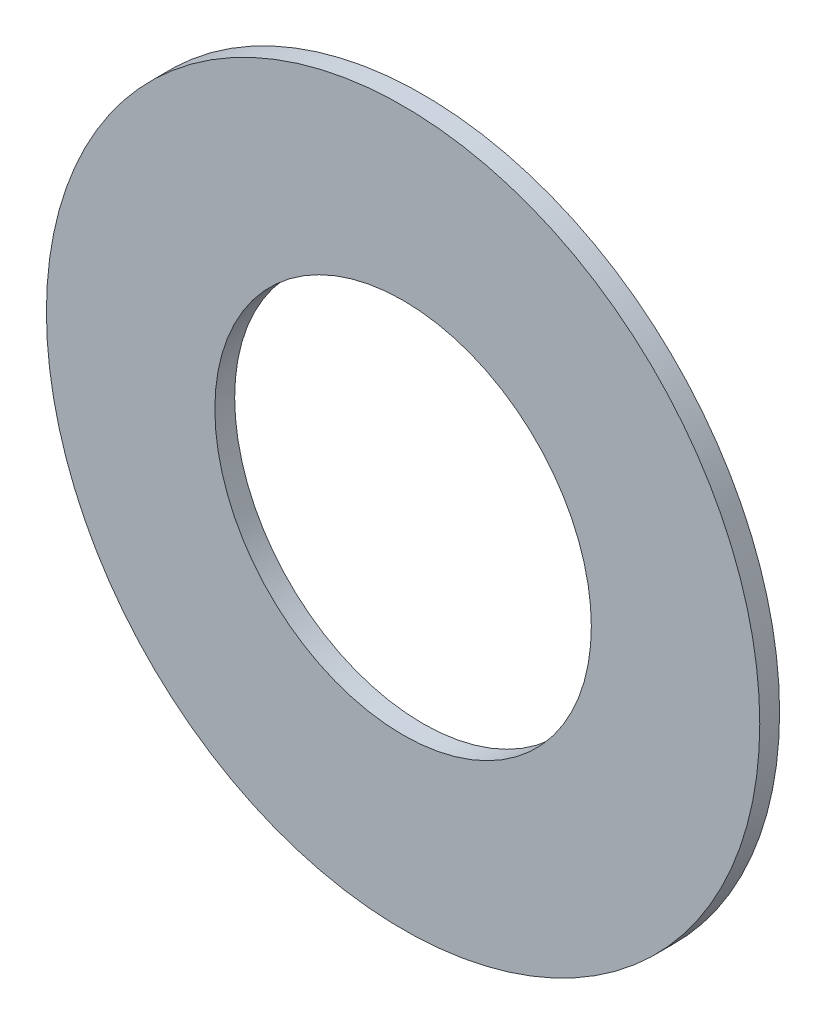
ISO-10303-21;
HEADER;
FILE_DESCRIPTION(('STEP AP214'),'2;1');
FILE_NAME('part.step','',(''),(''),'','','');
FILE_SCHEMA(('AUTOMOTIVE_DESIGN { 1 0 10303 214 1 1 1 1 }'));
ENDSEC;
DATA;
#1=APPLICATION_CONTEXT('core data for automotive mechanical design processes');
#2=APPLICATION_PROTOCOL_DEFINITION('international standard','automotive_design',2000,#1);
#3=PRODUCT_CONTEXT('',#1,'mechanical');
#4=PRODUCT('Part','Part','',(#3));
#5=PRODUCT_RELATED_PRODUCT_CATEGORY('part','',(#4));
#6=PRODUCT_DEFINITION_FORMATION('','',#4);
#7=PRODUCT_DEFINITION_CONTEXT('part definition',#1,'design');
#8=PRODUCT_DEFINITION('design','',#6,#7);
#9=PRODUCT_DEFINITION_SHAPE('','',#8);
#10=(LENGTH_UNIT() NAMED_UNIT(*) SI_UNIT(.MILLI.,.METRE.));
#11=(NAMED_UNIT(*) PLANE_ANGLE_UNIT() SI_UNIT($,.RADIAN.));
#12=(NAMED_UNIT(*) SI_UNIT($,.STERADIAN.) SOLID_ANGLE_UNIT());
#13=UNCERTAINTY_MEASURE_WITH_UNIT(LENGTH_MEASURE(1.E-05),#10,'distance_accuracy_value','');
#14=(GEOMETRIC_REPRESENTATION_CONTEXT(3) GLOBAL_UNCERTAINTY_ASSIGNED_CONTEXT((#13)) GLOBAL_UNIT_ASSIGNED_CONTEXT((#10,
#11,#12)) REPRESENTATION_CONTEXT('',''));
#15=CARTESIAN_POINT('',(0.,0.,0.));
#16=DIRECTION('',(0.,0.,1.));
#17=DIRECTION('',(1.,0.,0.));
#18=AXIS2_PLACEMENT_3D('',#15,#16,#17);
#19=CARTESIAN_POINT('',(0.,0.,3.));
#20=DIRECTION('',(0.,0.,1.));
#21=DIRECTION('',(1.,0.,0.));
#22=AXIS2_PLACEMENT_3D('',#19,#20,#21);
#23=PLANE('',#22);
#24=CARTESIAN_POINT('',(0.,0.,3.));
#25=DIRECTION('',(0.,0.,1.));
#26=DIRECTION('',(1.,0.,0.));
#27=AXIS2_PLACEMENT_3D('',#24,#25,#26);
#28=CIRCLE('',#27,54.);
#29=CARTESIAN_POINT('',(54.,0.,3.));
#30=VERTEX_POINT('',#29);
#31=EDGE_CURVE('E10',#30,#30,#28,.T.);
#32=ORIENTED_EDGE('',*,*,#31,.T.);
#33=EDGE_LOOP('',(#32));
#34=FACE_BOUND('',#33,.T.);
#35=CARTESIAN_POINT('',(0.,0.,3.));
#36=DIRECTION('',(0.,0.,1.));
#37=DIRECTION('',(1.,0.,0.));
#38=AXIS2_PLACEMENT_3D('',#35,#36,#37);
#39=CIRCLE('',#38,28.5);
#40=CARTESIAN_POINT('',(28.5,0.,3.));
#41=VERTEX_POINT('',#40);
#42=EDGE_CURVE('E41',#41,#41,#39,.T.);
#43=ORIENTED_EDGE('',*,*,#42,.F.);
#44=EDGE_LOOP('',(#43));
#45=FACE_BOUND('',#44,.T.);
#46=ADVANCED_FACE('F30',(#34,#45),#23,.T.);
#47=CARTESIAN_POINT('',(0.,0.,0.));
#48=DIRECTION('',(0.,0.,1.));
#49=DIRECTION('',(1.,0.,0.));
#50=AXIS2_PLACEMENT_3D('',#47,#48,#49);
#51=PLANE('',#50);
#52=CARTESIAN_POINT('',(0.,0.,0.));
#53=DIRECTION('',(0.,0.,1.));
#54=DIRECTION('',(1.,0.,0.));
#55=AXIS2_PLACEMENT_3D('',#52,#53,#54);
#56=CIRCLE('',#55,54.);
#57=CARTESIAN_POINT('',(54.,0.,0.));
#58=VERTEX_POINT('',#57);
#59=EDGE_CURVE('E34',#58,#58,#56,.T.);
#60=ORIENTED_EDGE('',*,*,#59,.F.);
#61=EDGE_LOOP('',(#60));
#62=FACE_BOUND('',#61,.T.);
#63=CARTESIAN_POINT('',(0.,0.,0.));
#64=DIRECTION('',(0.,0.,1.));
#65=DIRECTION('',(1.,0.,0.));
#66=AXIS2_PLACEMENT_3D('',#63,#64,#65);
#67=CIRCLE('',#66,28.5);
#68=CARTESIAN_POINT('',(28.5,0.,0.));
#69=VERTEX_POINT('',#68);
#70=EDGE_CURVE('E43',#69,#69,#67,.T.);
#71=ORIENTED_EDGE('',*,*,#70,.T.);
#72=EDGE_LOOP('',(#71));
#73=FACE_BOUND('',#72,.T.);
#74=ADVANCED_FACE('F53',(#62,#73),#51,.F.);
#75=CARTESIAN_POINT('',(0.,0.,3.));
#76=DIRECTION('',(0.,0.,-1.));
#77=DIRECTION('',(-1.,0.,0.));
#78=AXIS2_PLACEMENT_3D('',#75,#76,#77);
#79=CYLINDRICAL_SURFACE('',#78,54.);
#80=ORIENTED_EDGE('',*,*,#31,.F.);
#81=EDGE_LOOP('',(#80));
#82=FACE_BOUND('',#81,.T.);
#83=ORIENTED_EDGE('',*,*,#59,.T.);
#84=EDGE_LOOP('',(#83));
#85=FACE_BOUND('',#84,.T.);
#86=ADVANCED_FACE('F32',(#82,#85),#79,.T.);
#87=CARTESIAN_POINT('',(0.,0.,3.));
#88=DIRECTION('',(0.,0.,-1.));
#89=DIRECTION('',(-1.,0.,0.));
#90=AXIS2_PLACEMENT_3D('',#87,#88,#89);
#91=CYLINDRICAL_SURFACE('',#90,28.5);
#92=ORIENTED_EDGE('',*,*,#42,.T.);
#93=EDGE_LOOP('',(#92));
#94=FACE_BOUND('',#93,.T.);
#95=ORIENTED_EDGE('',*,*,#70,.F.);
#96=EDGE_LOOP('',(#95));
#97=FACE_BOUND('',#96,.T.);
#98=ADVANCED_FACE('F49',(#94,#97),#91,.F.);
#99=CLOSED_SHELL('',(#46,#74,#86,#98));
#100=MANIFOLD_SOLID_BREP('B2',#99);
#101=ADVANCED_BREP_SHAPE_REPRESENTATION('',(#18,#100),#14);
#102=SHAPE_DEFINITION_REPRESENTATION(#9,#101);
ENDSEC;
END-ISO-10303-21;
